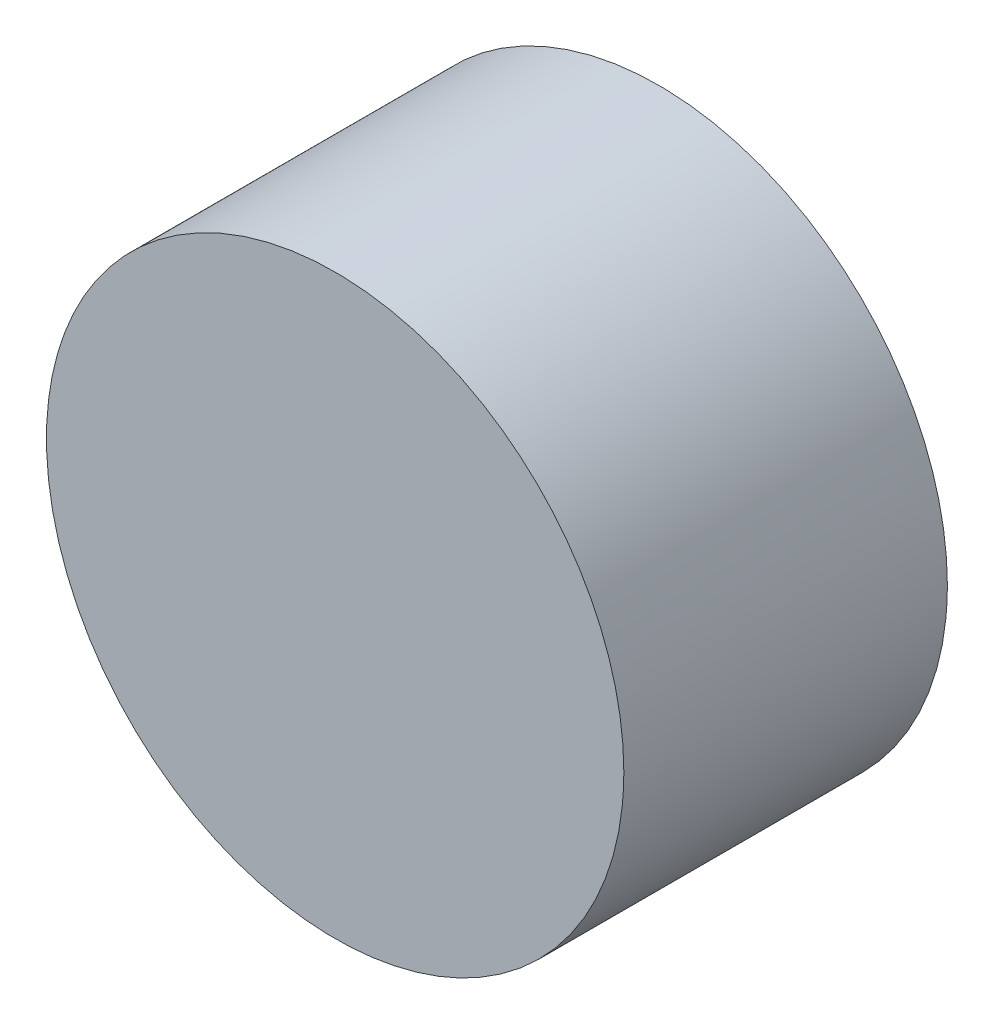
ISO-10303-21;
HEADER;
FILE_DESCRIPTION(('STEP AP214'),'2;1');
FILE_NAME('part.step','',(''),(''),'','','');
FILE_SCHEMA(('AUTOMOTIVE_DESIGN { 1 0 10303 214 1 1 1 1 }'));
ENDSEC;
DATA;
#1=APPLICATION_CONTEXT('core data for automotive mechanical design processes');
#2=APPLICATION_PROTOCOL_DEFINITION('international standard','automotive_design',2000,#1);
#3=PRODUCT_CONTEXT('',#1,'mechanical');
#4=PRODUCT('Part','Part','',(#3));
#5=PRODUCT_RELATED_PRODUCT_CATEGORY('part','',(#4));
#6=PRODUCT_DEFINITION_FORMATION('','',#4);
#7=PRODUCT_DEFINITION_CONTEXT('part definition',#1,'design');
#8=PRODUCT_DEFINITION('design','',#6,#7);
#9=PRODUCT_DEFINITION_SHAPE('','',#8);
#10=(LENGTH_UNIT() NAMED_UNIT(*) SI_UNIT(.MILLI.,.METRE.));
#11=(NAMED_UNIT(*) PLANE_ANGLE_UNIT() SI_UNIT($,.RADIAN.));
#12=(NAMED_UNIT(*) SI_UNIT($,.STERADIAN.) SOLID_ANGLE_UNIT());
#13=UNCERTAINTY_MEASURE_WITH_UNIT(LENGTH_MEASURE(1.E-05),#10,'distance_accuracy_value','');
#14=(GEOMETRIC_REPRESENTATION_CONTEXT(3) GLOBAL_UNCERTAINTY_ASSIGNED_CONTEXT((#13)) GLOBAL_UNIT_ASSIGNED_CONTEXT((#10,
#11,#12)) REPRESENTATION_CONTEXT('',''));
#15=CARTESIAN_POINT('',(0.,0.,0.));
#16=DIRECTION('',(0.,0.,1.));
#17=DIRECTION('',(1.,0.,0.));
#18=AXIS2_PLACEMENT_3D('',#15,#16,#17);
#19=CARTESIAN_POINT('',(-1.45,-1.45,0.6));
#20=CARTESIAN_POINT('',(-1.45,1.45,0.6));
#21=CARTESIAN_POINT('',(1.45,-1.45,0.6));
#22=CARTESIAN_POINT('',(1.45,1.45,0.6));
#23=(BOUNDED_SURFACE() B_SPLINE_SURFACE(1,1,((#19,#20),(#21,#22)),.UNSPECIFIED.,.F.,.F.,
.F.) B_SPLINE_SURFACE_WITH_KNOTS((2,2),(2,2),(-1.45,1.45),(-1.45,1.45),
.UNSPECIFIED.) GEOMETRIC_REPRESENTATION_ITEM() RATIONAL_B_SPLINE_SURFACE(((1.,1.),(1.,1.))) REPRESENTATION_ITEM('') SURFACE());
#24=CARTESIAN_POINT('',(1.45,0.,0.6));
#25=CARTESIAN_POINT('',(1.45,2.511473670975,0.6));
#26=CARTESIAN_POINT('',(-0.725,1.255736835487,0.6));
#27=CARTESIAN_POINT('',(-2.9,0.,0.6));
#28=CARTESIAN_POINT('',(-0.725,-1.255736835487,0.6));
#29=CARTESIAN_POINT('',(1.45,-2.511473670975,0.6));
#30=CARTESIAN_POINT('',(1.45,0.,0.6));
#31=(BOUNDED_CURVE() B_SPLINE_CURVE(2,(#24,#25,#26,#27,#28,#29,#30),.UNSPECIFIED.,.T.,
.F.) B_SPLINE_CURVE_WITH_KNOTS((3,2,2,3),(0.,2.094395102393,4.188790204786,6.28318530718),
.UNSPECIFIED.) CURVE() GEOMETRIC_REPRESENTATION_ITEM() RATIONAL_B_SPLINE_CURVE((1.,0.5,1.,0.5,
1.,0.5,1.)) REPRESENTATION_ITEM(''));
#32=CARTESIAN_POINT('',(1.45,0.,0.6));
#33=VERTEX_POINT('',#32);
#34=EDGE_CURVE('E11',#33,#33,#31,.T.);
#35=ORIENTED_EDGE('',*,*,#34,.F.);
#36=EDGE_LOOP('',(#35));
#37=FACE_BOUND('',#36,.T.);
#38=ADVANCED_FACE('F17',(#37),#23,.F.);
#39=CARTESIAN_POINT('',(-1.45,-1.45,2.225));
#40=CARTESIAN_POINT('',(-1.45,1.45,2.225));
#41=CARTESIAN_POINT('',(1.45,-1.45,2.225));
#42=CARTESIAN_POINT('',(1.45,1.45,2.225));
#43=(BOUNDED_SURFACE() B_SPLINE_SURFACE(1,1,((#39,#40),(#41,#42)),.UNSPECIFIED.,.F.,.F.,
.F.) B_SPLINE_SURFACE_WITH_KNOTS((2,2),(2,2),(-1.45,1.45),(-1.45,1.45),
.UNSPECIFIED.) GEOMETRIC_REPRESENTATION_ITEM() RATIONAL_B_SPLINE_SURFACE(((1.,1.),(1.,1.))) REPRESENTATION_ITEM('') SURFACE());
#44=CARTESIAN_POINT('',(1.45,0.,2.225));
#45=CARTESIAN_POINT('',(1.45,2.511473670975,2.225));
#46=CARTESIAN_POINT('',(-0.725,1.255736835487,2.225));
#47=CARTESIAN_POINT('',(-2.9,0.,2.225));
#48=CARTESIAN_POINT('',(-0.725,-1.255736835487,2.225));
#49=CARTESIAN_POINT('',(1.45,-2.511473670975,2.225));
#50=CARTESIAN_POINT('',(1.45,0.,2.225));
#51=(BOUNDED_CURVE() B_SPLINE_CURVE(2,(#44,#45,#46,#47,#48,#49,#50),.UNSPECIFIED.,.T.,
.F.) B_SPLINE_CURVE_WITH_KNOTS((3,2,2,3),(0.,2.094395102393,4.188790204786,6.28318530718),
.UNSPECIFIED.) CURVE() GEOMETRIC_REPRESENTATION_ITEM() RATIONAL_B_SPLINE_CURVE((1.,0.5,1.,0.5,
1.,0.5,1.)) REPRESENTATION_ITEM(''));
#52=CARTESIAN_POINT('',(1.45,0.,2.225));
#53=VERTEX_POINT('',#52);
#54=EDGE_CURVE('E45',#53,#53,#51,.T.);
#55=ORIENTED_EDGE('',*,*,#54,.T.);
#56=EDGE_LOOP('',(#55));
#57=FACE_BOUND('',#56,.T.);
#58=ADVANCED_FACE('F48',(#57),#43,.T.);
#59=CARTESIAN_POINT('',(1.45,0.,0.6));
#60=CARTESIAN_POINT('',(1.45,0.,2.225));
#61=CARTESIAN_POINT('',(1.45,2.511473670975,0.6));
#62=CARTESIAN_POINT('',(1.45,2.511473670975,2.225));
#63=CARTESIAN_POINT('',(-0.725,1.255736835487,0.6));
#64=CARTESIAN_POINT('',(-0.725,1.255736835487,2.225));
#65=CARTESIAN_POINT('',(-2.9,0.,0.6));
#66=CARTESIAN_POINT('',(-2.9,0.,2.225));
#67=CARTESIAN_POINT('',(-0.725,-1.255736835487,0.6));
#68=CARTESIAN_POINT('',(-0.725,-1.255736835487,2.225));
#69=CARTESIAN_POINT('',(1.45,-2.511473670975,0.6));
#70=CARTESIAN_POINT('',(1.45,-2.511473670975,2.225));
#71=CARTESIAN_POINT('',(1.45,0.,0.6));
#72=CARTESIAN_POINT('',(1.45,0.,2.225));
#73=(BOUNDED_SURFACE() B_SPLINE_SURFACE(2,1,((#59,#60),(#61,#62),(#63,#64),(#65,#66),(#67,#68),
(#69,#70),(#71,#72)),.UNSPECIFIED.,.T.,.F.,.F.) B_SPLINE_SURFACE_WITH_KNOTS((3,2,2,3),(2,2),(0.,
2.094395102393,4.188790204786,6.28318530718),(0.,1.625),
.UNSPECIFIED.) GEOMETRIC_REPRESENTATION_ITEM() RATIONAL_B_SPLINE_SURFACE(((1.,1.),(0.5,0.5),(1.,
1.),(0.5,0.5),(1.,1.),(0.5,0.5),(1.,1.))) REPRESENTATION_ITEM('') SURFACE());
#74=CARTESIAN_POINT('',(1.45,0.,0.6));
#75=CARTESIAN_POINT('',(1.45,0.,2.225));
#76=(BOUNDED_CURVE() B_SPLINE_CURVE(1,(#74,#75),.UNSPECIFIED.,.F.,
.F.) B_SPLINE_CURVE_WITH_KNOTS((2,2),(0.,1.625),
.UNSPECIFIED.) CURVE() GEOMETRIC_REPRESENTATION_ITEM() RATIONAL_B_SPLINE_CURVE((1.,1.)) REPRESENTATION_ITEM(''));
#77=EDGE_CURVE('E23',#33,#53,#76,.T.);
#78=ORIENTED_EDGE('',*,*,#54,.F.);
#79=ORIENTED_EDGE('',*,*,#77,.F.);
#80=ORIENTED_EDGE('',*,*,#34,.T.);
#81=ORIENTED_EDGE('',*,*,#77,.T.);
#82=EDGE_LOOP('',(#78,#79,#80,#81));
#83=FACE_BOUND('',#82,.T.);
#84=ADVANCED_FACE('F19',(#83),#73,.T.);
#85=CLOSED_SHELL('',(#38,#58,#84));
#86=MANIFOLD_SOLID_BREP('B1',#85);
#87=ADVANCED_BREP_SHAPE_REPRESENTATION('',(#18,#86),#14);
#88=SHAPE_DEFINITION_REPRESENTATION(#9,#87);
ENDSEC;
END-ISO-10303-21;
